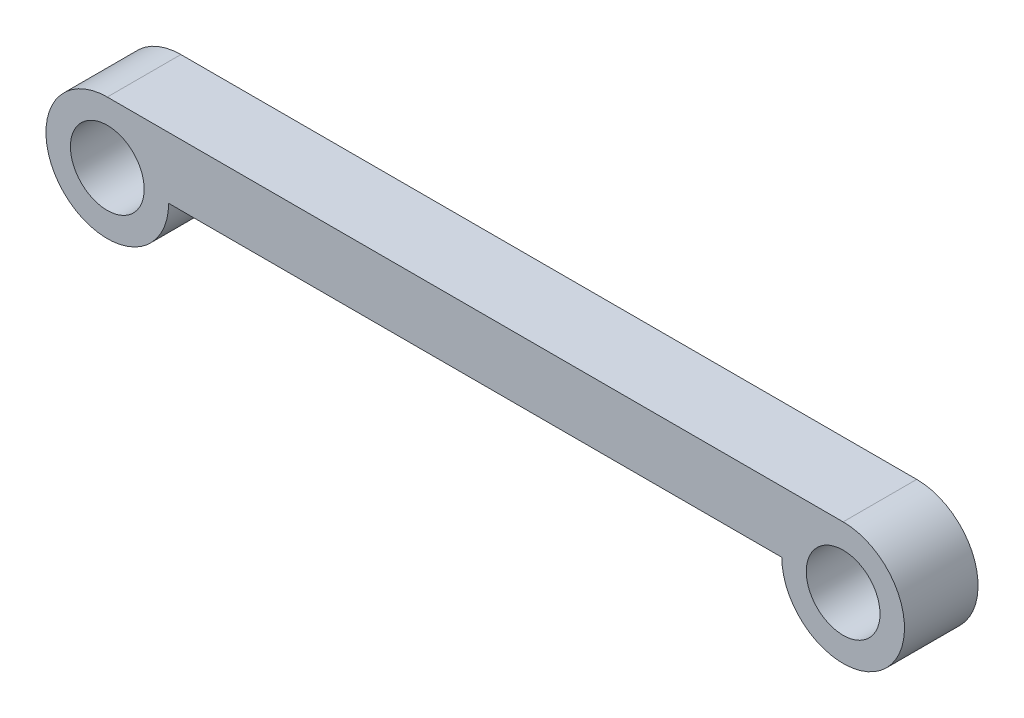
ISO-10303-21;
HEADER;
FILE_DESCRIPTION(('STEP AP214'),'2;1');
FILE_NAME('part.step','',(''),(''),'','','');
FILE_SCHEMA(('AUTOMOTIVE_DESIGN { 1 0 10303 214 1 1 1 1 }'));
ENDSEC;
DATA;
#1=APPLICATION_CONTEXT('core data for automotive mechanical design processes');
#2=APPLICATION_PROTOCOL_DEFINITION('international standard','automotive_design',2000,#1);
#3=PRODUCT_CONTEXT('',#1,'mechanical');
#4=PRODUCT('Part','Part','',(#3));
#5=PRODUCT_RELATED_PRODUCT_CATEGORY('part','',(#4));
#6=PRODUCT_DEFINITION_FORMATION('','',#4);
#7=PRODUCT_DEFINITION_CONTEXT('part definition',#1,'design');
#8=PRODUCT_DEFINITION('design','',#6,#7);
#9=PRODUCT_DEFINITION_SHAPE('','',#8);
#10=(LENGTH_UNIT() NAMED_UNIT(*) SI_UNIT(.MILLI.,.METRE.));
#11=(NAMED_UNIT(*) PLANE_ANGLE_UNIT() SI_UNIT($,.RADIAN.));
#12=(NAMED_UNIT(*) SI_UNIT($,.STERADIAN.) SOLID_ANGLE_UNIT());
#13=UNCERTAINTY_MEASURE_WITH_UNIT(LENGTH_MEASURE(1.E-05),#10,'distance_accuracy_value','');
#14=(GEOMETRIC_REPRESENTATION_CONTEXT(3) GLOBAL_UNCERTAINTY_ASSIGNED_CONTEXT((#13)) GLOBAL_UNIT_ASSIGNED_CONTEXT((#10,
#11,#12)) REPRESENTATION_CONTEXT('',''));
#15=CARTESIAN_POINT('',(0.,0.,0.));
#16=DIRECTION('',(0.,0.,1.));
#17=DIRECTION('',(1.,0.,0.));
#18=AXIS2_PLACEMENT_3D('',#15,#16,#17);
#19=CARTESIAN_POINT('',(-14.9981688091836,-2.50080692745972,3.));
#20=DIRECTION('',(0.,0.,1.));
#21=DIRECTION('',(1.,0.,0.));
#22=AXIS2_PLACEMENT_3D('',#19,#20,#21);
#23=PLANE('',#22);
#24=CARTESIAN_POINT('',(-14.9981688091836,-2.50080692745972,3.));
#25=DIRECTION('',(0.,0.,1.));
#26=DIRECTION('',(1.,0.,0.));
#27=AXIS2_PLACEMENT_3D('',#24,#25,#26);
#28=CIRCLE('',#27,1.50366128453313);
#29=CARTESIAN_POINT('',(-13.4945075246505,-2.50080692745972,3.));
#30=VERTEX_POINT('',#29);
#31=EDGE_CURVE('E111',#30,#30,#28,.T.);
#32=ORIENTED_EDGE('',*,*,#31,.F.);
#33=EDGE_LOOP('',(#32));
#34=FACE_BOUND('',#33,.T.);
#35=DIRECTION('',(-1.,0.,0.));
#36=VECTOR('',#35,1.);
#37=CARTESIAN_POINT('',(0.,0.,3.));
#38=LINE('',#37,#36);
#39=CARTESIAN_POINT('',(15.0022898047879,0.,3.));
#40=VERTEX_POINT('',#39);
#41=CARTESIAN_POINT('',(-14.9981688091836,0.,3.));
#42=VERTEX_POINT('',#41);
#43=EDGE_CURVE('E57',#40,#42,#38,.T.);
#44=ORIENTED_EDGE('',*,*,#43,.T.);
#45=CARTESIAN_POINT('',(-14.9981688091836,-2.50080692745972,3.));
#46=DIRECTION('',(0.,0.,1.));
#47=DIRECTION('',(1.,0.,0.));
#48=AXIS2_PLACEMENT_3D('',#45,#46,#47);
#49=CIRCLE('',#48,2.50080692745972);
#50=CARTESIAN_POINT('',(-12.4973618817239,-2.50080692745972,3.));
#51=VERTEX_POINT('',#50);
#52=EDGE_CURVE('E88',#42,#51,#49,.T.);
#53=ORIENTED_EDGE('',*,*,#52,.T.);
#54=DIRECTION('',(1.,0.,0.));
#55=VECTOR('',#54,1.);
#56=CARTESIAN_POINT('',(-12.4973618817239,-2.50080692745972,3.));
#57=LINE('',#56,#55);
#58=CARTESIAN_POINT('',(12.5014828773282,-2.50080692745972,3.));
#59=VERTEX_POINT('',#58);
#60=EDGE_CURVE('E92',#51,#59,#57,.T.);
#61=ORIENTED_EDGE('',*,*,#60,.T.);
#62=CARTESIAN_POINT('',(15.0022898047879,-2.50080692745972,3.));
#63=DIRECTION('',(0.,0.,1.));
#64=DIRECTION('',(-1.,0.,0.));
#65=AXIS2_PLACEMENT_3D('',#62,#63,#64);
#66=CIRCLE('',#65,2.50080692745972);
#67=EDGE_CURVE('E102',#59,#40,#66,.T.);
#68=ORIENTED_EDGE('',*,*,#67,.T.);
#69=EDGE_LOOP('',(#44,#53,#61,#68));
#70=FACE_BOUND('',#69,.T.);
#71=CARTESIAN_POINT('',(15.0022898047879,-2.50080692745972,3.));
#72=DIRECTION('',(0.,0.,1.));
#73=DIRECTION('',(1.,0.,0.));
#74=AXIS2_PLACEMENT_3D('',#71,#72,#73);
#75=CIRCLE('',#74,1.50403658676967);
#76=CARTESIAN_POINT('',(16.5063263915576,-2.50080692745972,3.));
#77=VERTEX_POINT('',#76);
#78=EDGE_CURVE('E155',#77,#77,#75,.T.);
#79=ORIENTED_EDGE('',*,*,#78,.F.);
#80=EDGE_LOOP('',(#79));
#81=FACE_BOUND('',#80,.T.);
#82=ADVANCED_FACE('F39',(#34,#70,#81),#23,.T.);
#83=CARTESIAN_POINT('',(-14.9981688091836,-2.50080692745972,0.));
#84=DIRECTION('',(0.,0.,1.));
#85=DIRECTION('',(1.,0.,0.));
#86=AXIS2_PLACEMENT_3D('',#83,#84,#85);
#87=PLANE('',#86);
#88=CARTESIAN_POINT('',(-14.9981688091836,-2.50080692745972,0.));
#89=DIRECTION('',(0.,0.,1.));
#90=DIRECTION('',(1.,0.,0.));
#91=AXIS2_PLACEMENT_3D('',#88,#89,#90);
#92=CIRCLE('',#91,2.50080692745972);
#93=CARTESIAN_POINT('',(-14.9981688091836,0.,0.));
#94=VERTEX_POINT('',#93);
#95=CARTESIAN_POINT('',(-12.4973618817239,-2.50080692745972,0.));
#96=VERTEX_POINT('',#95);
#97=EDGE_CURVE('E96',#94,#96,#92,.T.);
#98=ORIENTED_EDGE('',*,*,#97,.F.);
#99=DIRECTION('',(-1.,0.,0.));
#100=VECTOR('',#99,1.);
#101=CARTESIAN_POINT('',(0.,0.,0.));
#102=LINE('',#101,#100);
#103=CARTESIAN_POINT('',(15.0022898047879,0.,0.));
#104=VERTEX_POINT('',#103);
#105=EDGE_CURVE('E116',#104,#94,#102,.T.);
#106=ORIENTED_EDGE('',*,*,#105,.F.);
#107=CARTESIAN_POINT('',(15.0022898047879,-2.50080692745972,0.));
#108=DIRECTION('',(0.,0.,1.));
#109=DIRECTION('',(-1.,0.,0.));
#110=AXIS2_PLACEMENT_3D('',#107,#108,#109);
#111=CIRCLE('',#110,2.50080692745972);
#112=CARTESIAN_POINT('',(12.5014828773282,-2.50080692745972,0.));
#113=VERTEX_POINT('',#112);
#114=EDGE_CURVE('E82',#113,#104,#111,.T.);
#115=ORIENTED_EDGE('',*,*,#114,.F.);
#116=DIRECTION('',(1.,0.,0.));
#117=VECTOR('',#116,1.);
#118=CARTESIAN_POINT('',(-12.4973618817239,-2.50080692745972,0.));
#119=LINE('',#118,#117);
#120=EDGE_CURVE('E75',#96,#113,#119,.T.);
#121=ORIENTED_EDGE('',*,*,#120,.F.);
#122=EDGE_LOOP('',(#98,#106,#115,#121));
#123=FACE_BOUND('',#122,.T.);
#124=CARTESIAN_POINT('',(-14.9981688091836,-2.50080692745972,0.));
#125=DIRECTION('',(0.,0.,1.));
#126=DIRECTION('',(1.,0.,0.));
#127=AXIS2_PLACEMENT_3D('',#124,#125,#126);
#128=CIRCLE('',#127,1.50366128453313);
#129=CARTESIAN_POINT('',(-13.4945075246505,-2.50080692745972,0.));
#130=VERTEX_POINT('',#129);
#131=EDGE_CURVE('E163',#130,#130,#128,.T.);
#132=ORIENTED_EDGE('',*,*,#131,.T.);
#133=EDGE_LOOP('',(#132));
#134=FACE_BOUND('',#133,.T.);
#135=CARTESIAN_POINT('',(15.0022898047879,-2.50080692745972,0.));
#136=DIRECTION('',(0.,0.,1.));
#137=DIRECTION('',(1.,0.,0.));
#138=AXIS2_PLACEMENT_3D('',#135,#136,#137);
#139=CIRCLE('',#138,1.50403658676967);
#140=CARTESIAN_POINT('',(16.5063263915576,-2.50080692745972,0.));
#141=VERTEX_POINT('',#140);
#142=EDGE_CURVE('E158',#141,#141,#139,.T.);
#143=ORIENTED_EDGE('',*,*,#142,.T.);
#144=EDGE_LOOP('',(#143));
#145=FACE_BOUND('',#144,.T.);
#146=ADVANCED_FACE('F125',(#123,#134,#145),#87,.F.);
#147=CARTESIAN_POINT('',(-14.9981688091836,-2.50080692745972,3.));
#148=DIRECTION('',(0.,0.,-1.));
#149=DIRECTION('',(-1.,0.,0.));
#150=AXIS2_PLACEMENT_3D('',#147,#148,#149);
#151=CYLINDRICAL_SURFACE('',#150,2.50080692745972);
#152=ORIENTED_EDGE('',*,*,#97,.T.);
#153=DIRECTION('',(0.,0.,-1.));
#154=VECTOR('',#153,1.);
#155=CARTESIAN_POINT('',(-12.4973618817239,-2.50080692745972,3.));
#156=LINE('',#155,#154);
#157=EDGE_CURVE('E49',#51,#96,#156,.T.);
#158=ORIENTED_EDGE('',*,*,#157,.F.);
#159=ORIENTED_EDGE('',*,*,#52,.F.);
#160=DIRECTION('',(0.,0.,-1.));
#161=VECTOR('',#160,1.);
#162=CARTESIAN_POINT('',(-14.9981688091836,0.,3.));
#163=LINE('',#162,#161);
#164=EDGE_CURVE('E11',#42,#94,#163,.T.);
#165=ORIENTED_EDGE('',*,*,#164,.T.);
#166=EDGE_LOOP('',(#152,#158,#159,#165));
#167=FACE_BOUND('',#166,.T.);
#168=ADVANCED_FACE('F41',(#167),#151,.T.);
#169=CARTESIAN_POINT('',(-12.4973618817239,-2.50080692745972,3.));
#170=DIRECTION('',(0.,1.,0.));
#171=DIRECTION('',(0.,0.,1.));
#172=AXIS2_PLACEMENT_3D('',#169,#170,#171);
#173=PLANE('',#172);
#174=ORIENTED_EDGE('',*,*,#120,.T.);
#175=DIRECTION('',(0.,0.,-1.));
#176=VECTOR('',#175,1.);
#177=CARTESIAN_POINT('',(12.5014828773282,-2.50080692745972,3.));
#178=LINE('',#177,#176);
#179=EDGE_CURVE('E98',#59,#113,#178,.T.);
#180=ORIENTED_EDGE('',*,*,#179,.F.);
#181=ORIENTED_EDGE('',*,*,#60,.F.);
#182=ORIENTED_EDGE('',*,*,#157,.T.);
#183=EDGE_LOOP('',(#174,#180,#181,#182));
#184=FACE_BOUND('',#183,.T.);
#185=ADVANCED_FACE('F99',(#184),#173,.F.);
#186=CARTESIAN_POINT('',(15.0022898047879,-2.50080692745972,3.));
#187=DIRECTION('',(0.,0.,-1.));
#188=DIRECTION('',(-1.,0.,0.));
#189=AXIS2_PLACEMENT_3D('',#186,#187,#188);
#190=CYLINDRICAL_SURFACE('',#189,2.50080692745972);
#191=ORIENTED_EDGE('',*,*,#114,.T.);
#192=DIRECTION('',(0.,0.,-1.));
#193=VECTOR('',#192,1.);
#194=CARTESIAN_POINT('',(15.0022898047879,0.,3.));
#195=LINE('',#194,#193);
#196=EDGE_CURVE('E105',#40,#104,#195,.T.);
#197=ORIENTED_EDGE('',*,*,#196,.F.);
#198=ORIENTED_EDGE('',*,*,#67,.F.);
#199=ORIENTED_EDGE('',*,*,#179,.T.);
#200=EDGE_LOOP('',(#191,#197,#198,#199));
#201=FACE_BOUND('',#200,.T.);
#202=ADVANCED_FACE('F122',(#201),#190,.T.);
#203=CARTESIAN_POINT('',(0.,0.,3.));
#204=DIRECTION('',(0.,-1.,0.));
#205=DIRECTION('',(0.,0.,-1.));
#206=AXIS2_PLACEMENT_3D('',#203,#204,#205);
#207=PLANE('',#206);
#208=ORIENTED_EDGE('',*,*,#105,.T.);
#209=ORIENTED_EDGE('',*,*,#164,.F.);
#210=ORIENTED_EDGE('',*,*,#43,.F.);
#211=ORIENTED_EDGE('',*,*,#196,.T.);
#212=EDGE_LOOP('',(#208,#209,#210,#211));
#213=FACE_BOUND('',#212,.T.);
#214=ADVANCED_FACE('F127',(#213),#207,.F.);
#215=CARTESIAN_POINT('',(-14.9981688091836,-2.50080692745972,3.));
#216=DIRECTION('',(0.,0.,-1.));
#217=DIRECTION('',(-1.,0.,0.));
#218=AXIS2_PLACEMENT_3D('',#215,#216,#217);
#219=CYLINDRICAL_SURFACE('',#218,1.50366128453313);
#220=ORIENTED_EDGE('',*,*,#31,.T.);
#221=EDGE_LOOP('',(#220));
#222=FACE_BOUND('',#221,.T.);
#223=ORIENTED_EDGE('',*,*,#131,.F.);
#224=EDGE_LOOP('',(#223));
#225=FACE_BOUND('',#224,.T.);
#226=ADVANCED_FACE('F129',(#222,#225),#219,.F.);
#227=CARTESIAN_POINT('',(15.0022898047879,-2.50080692745972,3.));
#228=DIRECTION('',(0.,0.,-1.));
#229=DIRECTION('',(-1.,0.,0.));
#230=AXIS2_PLACEMENT_3D('',#227,#228,#229);
#231=CYLINDRICAL_SURFACE('',#230,1.50403658676967);
#232=ORIENTED_EDGE('',*,*,#78,.T.);
#233=EDGE_LOOP('',(#232));
#234=FACE_BOUND('',#233,.T.);
#235=ORIENTED_EDGE('',*,*,#142,.F.);
#236=EDGE_LOOP('',(#235));
#237=FACE_BOUND('',#236,.T.);
#238=ADVANCED_FACE('F135',(#234,#237),#231,.F.);
#239=CLOSED_SHELL('',(#82,#146,#168,#185,#202,#214,#226,#238));
#240=MANIFOLD_SOLID_BREP('B2',#239);
#241=ADVANCED_BREP_SHAPE_REPRESENTATION('',(#18,#240),#14);
#242=SHAPE_DEFINITION_REPRESENTATION(#9,#241);
ENDSEC;
END-ISO-10303-21;
